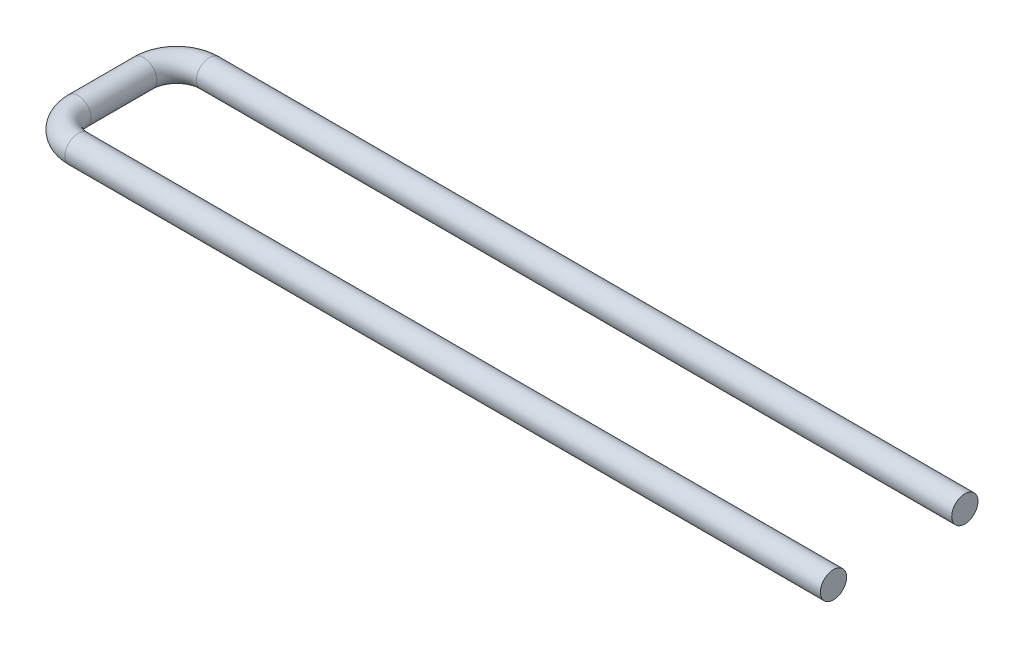
ISO-10303-21;
HEADER;
FILE_DESCRIPTION(('STEP AP214'),'2;1');
FILE_NAME('part.step','',(''),(''),'','','');
FILE_SCHEMA(('AUTOMOTIVE_DESIGN { 1 0 10303 214 1 1 1 1 }'));
ENDSEC;
DATA;
#1=APPLICATION_CONTEXT('core data for automotive mechanical design processes');
#2=APPLICATION_PROTOCOL_DEFINITION('international standard','automotive_design',2000,#1);
#3=PRODUCT_CONTEXT('',#1,'mechanical');
#4=PRODUCT('Part','Part','',(#3));
#5=PRODUCT_RELATED_PRODUCT_CATEGORY('part','',(#4));
#6=PRODUCT_DEFINITION_FORMATION('','',#4);
#7=PRODUCT_DEFINITION_CONTEXT('part definition',#1,'design');
#8=PRODUCT_DEFINITION('design','',#6,#7);
#9=PRODUCT_DEFINITION_SHAPE('','',#8);
#10=(LENGTH_UNIT() NAMED_UNIT(*) SI_UNIT(.MILLI.,.METRE.));
#11=(NAMED_UNIT(*) PLANE_ANGLE_UNIT() SI_UNIT($,.RADIAN.));
#12=(NAMED_UNIT(*) SI_UNIT($,.STERADIAN.) SOLID_ANGLE_UNIT());
#13=UNCERTAINTY_MEASURE_WITH_UNIT(LENGTH_MEASURE(1.E-05),#10,'distance_accuracy_value','');
#14=(GEOMETRIC_REPRESENTATION_CONTEXT(3) GLOBAL_UNCERTAINTY_ASSIGNED_CONTEXT((#13)) GLOBAL_UNIT_ASSIGNED_CONTEXT((#10,
#11,#12)) REPRESENTATION_CONTEXT('',''));
#15=CARTESIAN_POINT('',(0.,0.,0.));
#16=DIRECTION('',(0.,0.,1.));
#17=DIRECTION('',(1.,0.,0.));
#18=AXIS2_PLACEMENT_3D('',#15,#16,#17);
#19=CARTESIAN_POINT('',(-115.,0.,-20.));
#20=DIRECTION('',(1.,0.,0.));
#21=DIRECTION('',(0.,0.,-1.));
#22=AXIS2_PLACEMENT_3D('',#19,#20,#21);
#23=CYLINDRICAL_SURFACE('',#22,2.);
#24=CARTESIAN_POINT('',(-115.,0.,-20.));
#25=DIRECTION('',(-1.,0.,0.));
#26=DIRECTION('',(0.,0.,1.));
#27=AXIS2_PLACEMENT_3D('',#24,#25,#26);
#28=CIRCLE('',#27,2.);
#29=CARTESIAN_POINT('',(-115.,0.,-22.));
#30=VERTEX_POINT('',#29);
#31=EDGE_CURVE('E36',#30,#30,#28,.T.);
#32=ORIENTED_EDGE('',*,*,#31,.F.);
#33=EDGE_LOOP('',(#32));
#34=FACE_BOUND('',#33,.T.);
#35=CARTESIAN_POINT('',(0.,0.,-20.));
#36=DIRECTION('',(-1.,0.,0.));
#37=DIRECTION('',(0.,0.,1.));
#38=AXIS2_PLACEMENT_3D('',#35,#36,#37);
#39=CIRCLE('',#38,2.);
#40=CARTESIAN_POINT('',(0.,0.,-18.));
#41=VERTEX_POINT('',#40);
#42=EDGE_CURVE('E10',#41,#41,#39,.T.);
#43=ORIENTED_EDGE('',*,*,#42,.T.);
#44=EDGE_LOOP('',(#43));
#45=FACE_BOUND('',#44,.T.);
#46=ADVANCED_FACE('F30',(#34,#45),#23,.T.);
#47=CARTESIAN_POINT('',(-115.,0.,-15.));
#48=DIRECTION('',(0.,-1.,0.));
#49=DIRECTION('',(0.,0.,-1.));
#50=AXIS2_PLACEMENT_3D('',#47,#48,#49);
#51=TOROIDAL_SURFACE('',#50,4.99999999999999,2.);
#52=CARTESIAN_POINT('',(-120.,0.,-15.));
#53=DIRECTION('',(0.,0.,1.));
#54=DIRECTION('',(1.,0.,0.));
#55=AXIS2_PLACEMENT_3D('',#52,#53,#54);
#56=CIRCLE('',#55,2.);
#57=CARTESIAN_POINT('',(-122.,0.,-15.));
#58=VERTEX_POINT('',#57);
#59=EDGE_CURVE('E40',#58,#58,#56,.T.);
#60=CARTESIAN_POINT('',(-115.,0.,-15.));
#61=DIRECTION('',(0.,-1.,0.));
#62=DIRECTION('',(0.,0.,-1.));
#63=AXIS2_PLACEMENT_3D('',#60,#61,#62);
#64=CIRCLE('',#63,6.99999999999999);
#65=EDGE_CURVE('',#58,#30,#64,.T.);
#66=ORIENTED_EDGE('',*,*,#59,.F.);
#67=ORIENTED_EDGE('',*,*,#31,.T.);
#68=ORIENTED_EDGE('',*,*,#65,.T.);
#69=ORIENTED_EDGE('',*,*,#65,.F.);
#70=EDGE_LOOP('',(#66,#68,#67,#69));
#71=FACE_BOUND('',#70,.T.);
#72=ADVANCED_FACE('F68',(#71),#51,.T.);
#73=CARTESIAN_POINT('',(-120.,0.,-4.99999999999999));
#74=DIRECTION('',(0.,0.,-1.));
#75=DIRECTION('',(-1.,0.,0.));
#76=AXIS2_PLACEMENT_3D('',#73,#74,#75);
#77=CYLINDRICAL_SURFACE('',#76,2.);
#78=CARTESIAN_POINT('',(-120.,0.,-4.99999999999999));
#79=DIRECTION('',(0.,0.,1.));
#80=DIRECTION('',(1.,0.,0.));
#81=AXIS2_PLACEMENT_3D('',#78,#79,#80);
#82=CIRCLE('',#81,2.);
#83=CARTESIAN_POINT('',(-122.,0.,-4.99999999999999));
#84=VERTEX_POINT('',#83);
#85=EDGE_CURVE('E44',#84,#84,#82,.T.);
#86=ORIENTED_EDGE('',*,*,#85,.F.);
#87=EDGE_LOOP('',(#86));
#88=FACE_BOUND('',#87,.T.);
#89=ORIENTED_EDGE('',*,*,#59,.T.);
#90=EDGE_LOOP('',(#89));
#91=FACE_BOUND('',#90,.T.);
#92=ADVANCED_FACE('F62',(#88,#91),#77,.T.);
#93=CARTESIAN_POINT('',(-115.,0.,-4.99999999999999));
#94=DIRECTION('',(0.,-1.,0.));
#95=DIRECTION('',(0.,0.,-1.));
#96=AXIS2_PLACEMENT_3D('',#93,#94,#95);
#97=TOROIDAL_SURFACE('',#96,5.,2.);
#98=CARTESIAN_POINT('',(-115.,0.,0.));
#99=DIRECTION('',(1.,0.,0.));
#100=DIRECTION('',(0.,0.,-1.));
#101=AXIS2_PLACEMENT_3D('',#98,#99,#100);
#102=CIRCLE('',#101,2.);
#103=CARTESIAN_POINT('',(-115.,0.,2.00000000000001));
#104=VERTEX_POINT('',#103);
#105=EDGE_CURVE('E49',#104,#104,#102,.T.);
#106=CARTESIAN_POINT('',(-115.,0.,-4.99999999999999));
#107=DIRECTION('',(0.,-1.,0.));
#108=DIRECTION('',(0.,0.,-1.));
#109=AXIS2_PLACEMENT_3D('',#106,#107,#108);
#110=CIRCLE('',#109,7.);
#111=EDGE_CURVE('',#104,#84,#110,.T.);
#112=ORIENTED_EDGE('',*,*,#105,.F.);
#113=ORIENTED_EDGE('',*,*,#85,.T.);
#114=ORIENTED_EDGE('',*,*,#111,.T.);
#115=ORIENTED_EDGE('',*,*,#111,.F.);
#116=EDGE_LOOP('',(#112,#114,#113,#115));
#117=FACE_BOUND('',#116,.T.);
#118=ADVANCED_FACE('F59',(#117),#97,.T.);
#119=CARTESIAN_POINT('',(-115.,0.,0.));
#120=DIRECTION('',(1.,0.,0.));
#121=DIRECTION('',(0.,0.,-1.));
#122=AXIS2_PLACEMENT_3D('',#119,#120,#121);
#123=CYLINDRICAL_SURFACE('',#122,2.);
#124=ORIENTED_EDGE('',*,*,#105,.T.);
#125=EDGE_LOOP('',(#124));
#126=FACE_BOUND('',#125,.T.);
#127=CARTESIAN_POINT('',(0.,0.,0.));
#128=DIRECTION('',(1.,0.,0.));
#129=DIRECTION('',(0.,0.,-1.));
#130=AXIS2_PLACEMENT_3D('',#127,#128,#129);
#131=CIRCLE('',#130,2.);
#132=CARTESIAN_POINT('',(0.,0.,-2.));
#133=VERTEX_POINT('',#132);
#134=EDGE_CURVE('E50',#133,#133,#131,.T.);
#135=ORIENTED_EDGE('',*,*,#134,.F.);
#136=EDGE_LOOP('',(#135));
#137=FACE_BOUND('',#136,.T.);
#138=ADVANCED_FACE('F56',(#126,#137),#123,.T.);
#139=CARTESIAN_POINT('',(0.,0.,-20.));
#140=DIRECTION('',(-1.,0.,0.));
#141=DIRECTION('',(0.,0.,1.));
#142=AXIS2_PLACEMENT_3D('',#139,#140,#141);
#143=PLANE('',#142);
#144=ORIENTED_EDGE('',*,*,#42,.F.);
#145=EDGE_LOOP('',(#144));
#146=FACE_BOUND('',#145,.T.);
#147=ADVANCED_FACE('F80',(#146),#143,.F.);
#148=CARTESIAN_POINT('',(0.,0.,0.));
#149=DIRECTION('',(1.,0.,0.));
#150=DIRECTION('',(0.,0.,-1.));
#151=AXIS2_PLACEMENT_3D('',#148,#149,#150);
#152=PLANE('',#151);
#153=ORIENTED_EDGE('',*,*,#134,.T.);
#154=EDGE_LOOP('',(#153));
#155=FACE_BOUND('',#154,.T.);
#156=ADVANCED_FACE('F81',(#155),#152,.T.);
#157=CLOSED_SHELL('',(#46,#72,#92,#118,#138,#147,#156));
#158=MANIFOLD_SOLID_BREP('B2',#157);
#159=ADVANCED_BREP_SHAPE_REPRESENTATION('',(#18,#158),#14);
#160=SHAPE_DEFINITION_REPRESENTATION(#9,#159);
ENDSEC;
END-ISO-10303-21;
